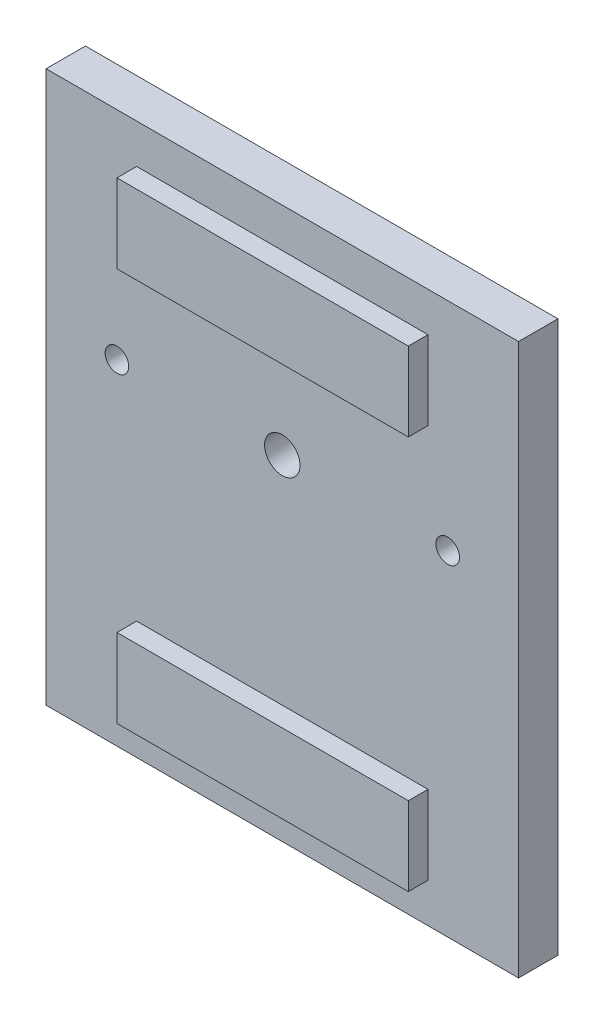
ISO-10303-21;
HEADER;
FILE_DESCRIPTION(('STEP AP214'),'2;1');
FILE_NAME('part.step','',(''),(''),'','','');
FILE_SCHEMA(('AUTOMOTIVE_DESIGN { 1 0 10303 214 1 1 1 1 }'));
ENDSEC;
DATA;
#1=APPLICATION_CONTEXT('core data for automotive mechanical design processes');
#2=APPLICATION_PROTOCOL_DEFINITION('international standard','automotive_design',2000,#1);
#3=PRODUCT_CONTEXT('',#1,'mechanical');
#4=PRODUCT('Part','Part','',(#3));
#5=PRODUCT_RELATED_PRODUCT_CATEGORY('part','',(#4));
#6=PRODUCT_DEFINITION_FORMATION('','',#4);
#7=PRODUCT_DEFINITION_CONTEXT('part definition',#1,'design');
#8=PRODUCT_DEFINITION('design','',#6,#7);
#9=PRODUCT_DEFINITION_SHAPE('','',#8);
#10=(LENGTH_UNIT() NAMED_UNIT(*) SI_UNIT(.MILLI.,.METRE.));
#11=(NAMED_UNIT(*) PLANE_ANGLE_UNIT() SI_UNIT($,.RADIAN.));
#12=(NAMED_UNIT(*) SI_UNIT($,.STERADIAN.) SOLID_ANGLE_UNIT());
#13=UNCERTAINTY_MEASURE_WITH_UNIT(LENGTH_MEASURE(1.E-05),#10,'distance_accuracy_value','');
#14=(GEOMETRIC_REPRESENTATION_CONTEXT(3) GLOBAL_UNCERTAINTY_ASSIGNED_CONTEXT((#13)) GLOBAL_UNIT_ASSIGNED_CONTEXT((#10,
#11,#12)) REPRESENTATION_CONTEXT('',''));
#15=CARTESIAN_POINT('',(0.,0.,0.));
#16=DIRECTION('',(0.,0.,1.));
#17=DIRECTION('',(1.,0.,0.));
#18=AXIS2_PLACEMENT_3D('',#15,#16,#17);
#19=CARTESIAN_POINT('',(0.,0.,10.));
#20=DIRECTION('',(0.,0.,-1.));
#21=DIRECTION('',(-1.,0.,0.));
#22=AXIS2_PLACEMENT_3D('',#19,#20,#21);
#23=PLANE('',#22);
#24=CARTESIAN_POINT('',(-102.,-55.,10.));
#25=DIRECTION('',(0.,0.,-1.));
#26=DIRECTION('',(-1.,0.,0.));
#27=AXIS2_PLACEMENT_3D('',#24,#25,#26);
#28=CIRCLE('',#27,3.00000000000001);
#29=CARTESIAN_POINT('',(-105.,-55.,10.));
#30=VERTEX_POINT('',#29);
#31=EDGE_CURVE('E406',#30,#30,#28,.T.);
#32=ORIENTED_EDGE('',*,*,#31,.T.);
#33=EDGE_LOOP('',(#32));
#34=FACE_BOUND('',#33,.T.);
#35=CARTESIAN_POINT('',(-60.,-55.,10.));
#36=DIRECTION('',(0.,0.,-1.));
#37=DIRECTION('',(-1.,0.,0.));
#38=AXIS2_PLACEMENT_3D('',#35,#36,#37);
#39=CIRCLE('',#38,4.50000000000001);
#40=CARTESIAN_POINT('',(-64.5,-55.,10.));
#41=VERTEX_POINT('',#40);
#42=EDGE_CURVE('E407',#41,#41,#39,.T.);
#43=ORIENTED_EDGE('',*,*,#42,.T.);
#44=EDGE_LOOP('',(#43));
#45=FACE_BOUND('',#44,.T.);
#46=CARTESIAN_POINT('',(-18.,-55.,10.));
#47=DIRECTION('',(0.,0.,-1.));
#48=DIRECTION('',(-1.,0.,0.));
#49=AXIS2_PLACEMENT_3D('',#46,#47,#48);
#50=CIRCLE('',#49,3.);
#51=CARTESIAN_POINT('',(-21.,-55.,10.));
#52=VERTEX_POINT('',#51);
#53=EDGE_CURVE('E411',#52,#52,#50,.T.);
#54=ORIENTED_EDGE('',*,*,#53,.T.);
#55=EDGE_LOOP('',(#54));
#56=FACE_BOUND('',#55,.T.);
#57=DIRECTION('',(0.,-1.,0.));
#58=VECTOR('',#57,1.);
#59=CARTESIAN_POINT('',(-97.,-10.,10.));
#60=LINE('',#59,#58);
#61=CARTESIAN_POINT('',(-97.,-10.,10.));
#62=VERTEX_POINT('',#61);
#63=CARTESIAN_POINT('',(-97.,-30.,10.));
#64=VERTEX_POINT('',#63);
#65=EDGE_CURVE('E145',#62,#64,#60,.T.);
#66=ORIENTED_EDGE('',*,*,#65,.F.);
#67=DIRECTION('',(-1.,0.,0.));
#68=VECTOR('',#67,1.);
#69=CARTESIAN_POINT('',(-97.,-10.,10.));
#70=LINE('',#69,#68);
#71=CARTESIAN_POINT('',(-23.,-10.,10.));
#72=VERTEX_POINT('',#71);
#73=EDGE_CURVE('E158',#72,#62,#70,.T.);
#74=ORIENTED_EDGE('',*,*,#73,.F.);
#75=DIRECTION('',(0.,1.,0.));
#76=VECTOR('',#75,1.);
#77=CARTESIAN_POINT('',(-23.,-10.,10.));
#78=LINE('',#77,#76);
#79=CARTESIAN_POINT('',(-23.,-30.,10.));
#80=VERTEX_POINT('',#79);
#81=EDGE_CURVE('E167',#80,#72,#78,.T.);
#82=ORIENTED_EDGE('',*,*,#81,.F.);
#83=DIRECTION('',(1.,0.,0.));
#84=VECTOR('',#83,1.);
#85=CARTESIAN_POINT('',(-97.,-30.,10.));
#86=LINE('',#85,#84);
#87=EDGE_CURVE('E148',#64,#80,#86,.T.);
#88=ORIENTED_EDGE('',*,*,#87,.F.);
#89=EDGE_LOOP('',(#66,#74,#82,#88));
#90=FACE_BOUND('',#89,.T.);
#91=DIRECTION('',(0.,1.,0.));
#92=VECTOR('',#91,1.);
#93=CARTESIAN_POINT('',(0.,0.,10.));
#94=LINE('',#93,#92);
#95=CARTESIAN_POINT('',(0.,-140.,10.));
#96=VERTEX_POINT('',#95);
#97=CARTESIAN_POINT('',(0.,0.,10.));
#98=VERTEX_POINT('',#97);
#99=EDGE_CURVE('E184',#96,#98,#94,.T.);
#100=ORIENTED_EDGE('',*,*,#99,.T.);
#101=DIRECTION('',(-1.,0.,0.));
#102=VECTOR('',#101,1.);
#103=CARTESIAN_POINT('',(0.,0.,10.));
#104=LINE('',#103,#102);
#105=CARTESIAN_POINT('',(-120.,0.,10.));
#106=VERTEX_POINT('',#105);
#107=EDGE_CURVE('E187',#98,#106,#104,.T.);
#108=ORIENTED_EDGE('',*,*,#107,.T.);
#109=DIRECTION('',(0.,-1.,0.));
#110=VECTOR('',#109,1.);
#111=CARTESIAN_POINT('',(-120.,0.,10.));
#112=LINE('',#111,#110);
#113=CARTESIAN_POINT('',(-120.,-140.,10.));
#114=VERTEX_POINT('',#113);
#115=EDGE_CURVE('E190',#106,#114,#112,.T.);
#116=ORIENTED_EDGE('',*,*,#115,.T.);
#117=DIRECTION('',(1.,0.,0.));
#118=VECTOR('',#117,1.);
#119=CARTESIAN_POINT('',(0.,-140.,10.));
#120=LINE('',#119,#118);
#121=EDGE_CURVE('E192',#114,#96,#120,.T.);
#122=ORIENTED_EDGE('',*,*,#121,.T.);
#123=EDGE_LOOP('',(#100,#108,#116,#122));
#124=FACE_BOUND('',#123,.T.);
#125=DIRECTION('',(0.,-1.,0.));
#126=VECTOR('',#125,1.);
#127=CARTESIAN_POINT('',(-97.,-110.,10.));
#128=LINE('',#127,#126);
#129=CARTESIAN_POINT('',(-97.,-110.,10.));
#130=VERTEX_POINT('',#129);
#131=CARTESIAN_POINT('',(-97.,-130.,10.));
#132=VERTEX_POINT('',#131);
#133=EDGE_CURVE('E144',#130,#132,#128,.T.);
#134=ORIENTED_EDGE('',*,*,#133,.F.);
#135=DIRECTION('',(-1.,0.,0.));
#136=VECTOR('',#135,1.);
#137=CARTESIAN_POINT('',(-97.,-110.,10.));
#138=LINE('',#137,#136);
#139=CARTESIAN_POINT('',(-23.,-110.,10.));
#140=VERTEX_POINT('',#139);
#141=EDGE_CURVE('E141',#140,#130,#138,.T.);
#142=ORIENTED_EDGE('',*,*,#141,.F.);
#143=DIRECTION('',(0.,1.,0.));
#144=VECTOR('',#143,1.);
#145=CARTESIAN_POINT('',(-23.,-110.,10.));
#146=LINE('',#145,#144);
#147=CARTESIAN_POINT('',(-23.,-130.,10.));
#148=VERTEX_POINT('',#147);
#149=EDGE_CURVE('E55',#148,#140,#146,.T.);
#150=ORIENTED_EDGE('',*,*,#149,.F.);
#151=DIRECTION('',(1.,0.,0.));
#152=VECTOR('',#151,1.);
#153=CARTESIAN_POINT('',(-97.,-130.,10.));
#154=LINE('',#153,#152);
#155=EDGE_CURVE('E50',#132,#148,#154,.T.);
#156=ORIENTED_EDGE('',*,*,#155,.F.);
#157=EDGE_LOOP('',(#134,#142,#150,#156));
#158=FACE_BOUND('',#157,.T.);
#159=ADVANCED_FACE('F35',(#34,#45,#56,#90,#124,#158),#23,.F.);
#160=CARTESIAN_POINT('',(0.,0.,10.));
#161=DIRECTION('',(-1.,0.,0.));
#162=DIRECTION('',(0.,-1.,0.));
#163=AXIS2_PLACEMENT_3D('',#160,#161,#162);
#164=PLANE('',#163);
#165=DIRECTION('',(0.,1.,0.));
#166=VECTOR('',#165,1.);
#167=CARTESIAN_POINT('',(0.,0.,0.));
#168=LINE('',#167,#166);
#169=CARTESIAN_POINT('',(0.,-140.,0.));
#170=VERTEX_POINT('',#169);
#171=CARTESIAN_POINT('',(0.,0.,0.));
#172=VERTEX_POINT('',#171);
#173=EDGE_CURVE('E183',#170,#172,#168,.T.);
#174=ORIENTED_EDGE('',*,*,#173,.T.);
#175=DIRECTION('',(0.,0.,-1.));
#176=VECTOR('',#175,1.);
#177=CARTESIAN_POINT('',(0.,0.,10.));
#178=LINE('',#177,#176);
#179=EDGE_CURVE('E11',#98,#172,#178,.T.);
#180=ORIENTED_EDGE('',*,*,#179,.F.);
#181=ORIENTED_EDGE('',*,*,#99,.F.);
#182=DIRECTION('',(0.,0.,-1.));
#183=VECTOR('',#182,1.);
#184=CARTESIAN_POINT('',(0.,-140.,10.));
#185=LINE('',#184,#183);
#186=EDGE_CURVE('E194',#96,#170,#185,.T.);
#187=ORIENTED_EDGE('',*,*,#186,.T.);
#188=EDGE_LOOP('',(#174,#180,#181,#187));
#189=FACE_BOUND('',#188,.T.);
#190=ADVANCED_FACE('F37',(#189),#164,.F.);
#191=CARTESIAN_POINT('',(0.,0.,10.));
#192=DIRECTION('',(0.,-1.,0.));
#193=DIRECTION('',(1.,0.,0.));
#194=AXIS2_PLACEMENT_3D('',#191,#192,#193);
#195=PLANE('',#194);
#196=DIRECTION('',(-1.,0.,0.));
#197=VECTOR('',#196,1.);
#198=CARTESIAN_POINT('',(0.,0.,0.));
#199=LINE('',#198,#197);
#200=CARTESIAN_POINT('',(-120.,0.,0.));
#201=VERTEX_POINT('',#200);
#202=EDGE_CURVE('E197',#172,#201,#199,.T.);
#203=ORIENTED_EDGE('',*,*,#202,.T.);
#204=DIRECTION('',(0.,0.,-1.));
#205=VECTOR('',#204,1.);
#206=CARTESIAN_POINT('',(-120.,0.,10.));
#207=LINE('',#206,#205);
#208=EDGE_CURVE('E43',#106,#201,#207,.T.);
#209=ORIENTED_EDGE('',*,*,#208,.F.);
#210=ORIENTED_EDGE('',*,*,#107,.F.);
#211=ORIENTED_EDGE('',*,*,#179,.T.);
#212=EDGE_LOOP('',(#203,#209,#210,#211));
#213=FACE_BOUND('',#212,.T.);
#214=ADVANCED_FACE('F226',(#213),#195,.F.);
#215=CARTESIAN_POINT('',(-120.,0.,10.));
#216=DIRECTION('',(1.,0.,0.));
#217=DIRECTION('',(0.,1.,0.));
#218=AXIS2_PLACEMENT_3D('',#215,#216,#217);
#219=PLANE('',#218);
#220=DIRECTION('',(0.,-1.,0.));
#221=VECTOR('',#220,1.);
#222=CARTESIAN_POINT('',(-120.,0.,0.));
#223=LINE('',#222,#221);
#224=CARTESIAN_POINT('',(-120.,-140.,0.));
#225=VERTEX_POINT('',#224);
#226=EDGE_CURVE('E199',#201,#225,#223,.T.);
#227=ORIENTED_EDGE('',*,*,#226,.T.);
#228=DIRECTION('',(0.,0.,-1.));
#229=VECTOR('',#228,1.);
#230=CARTESIAN_POINT('',(-120.,-140.,10.));
#231=LINE('',#230,#229);
#232=EDGE_CURVE('E204',#114,#225,#231,.T.);
#233=ORIENTED_EDGE('',*,*,#232,.F.);
#234=ORIENTED_EDGE('',*,*,#115,.F.);
#235=ORIENTED_EDGE('',*,*,#208,.T.);
#236=EDGE_LOOP('',(#227,#233,#234,#235));
#237=FACE_BOUND('',#236,.T.);
#238=ADVANCED_FACE('F211',(#237),#219,.F.);
#239=CARTESIAN_POINT('',(0.,-140.,10.));
#240=DIRECTION('',(0.,1.,0.));
#241=DIRECTION('',(0.,0.,1.));
#242=AXIS2_PLACEMENT_3D('',#239,#240,#241);
#243=PLANE('',#242);
#244=DIRECTION('',(1.,0.,0.));
#245=VECTOR('',#244,1.);
#246=CARTESIAN_POINT('',(0.,-140.,0.));
#247=LINE('',#246,#245);
#248=EDGE_CURVE('E188',#225,#170,#247,.T.);
#249=ORIENTED_EDGE('',*,*,#248,.T.);
#250=ORIENTED_EDGE('',*,*,#186,.F.);
#251=ORIENTED_EDGE('',*,*,#121,.F.);
#252=ORIENTED_EDGE('',*,*,#232,.T.);
#253=EDGE_LOOP('',(#249,#250,#251,#252));
#254=FACE_BOUND('',#253,.T.);
#255=ADVANCED_FACE('F220',(#254),#243,.F.);
#256=CARTESIAN_POINT('',(0.,0.,0.));
#257=DIRECTION('',(0.,0.,-1.));
#258=DIRECTION('',(-1.,0.,0.));
#259=AXIS2_PLACEMENT_3D('',#256,#257,#258);
#260=PLANE('',#259);
#261=CARTESIAN_POINT('',(-102.,-55.,0.));
#262=DIRECTION('',(0.,0.,1.));
#263=DIRECTION('',(1.,0.,0.));
#264=AXIS2_PLACEMENT_3D('',#261,#262,#263);
#265=CIRCLE('',#264,3.00000000000001);
#266=CARTESIAN_POINT('',(-99.,-55.,0.));
#267=VERTEX_POINT('',#266);
#268=EDGE_CURVE('E404',#267,#267,#265,.T.);
#269=ORIENTED_EDGE('',*,*,#268,.T.);
#270=EDGE_LOOP('',(#269));
#271=FACE_BOUND('',#270,.T.);
#272=CARTESIAN_POINT('',(-60.,-55.,0.));
#273=DIRECTION('',(0.,0.,1.));
#274=DIRECTION('',(1.,0.,0.));
#275=AXIS2_PLACEMENT_3D('',#272,#273,#274);
#276=CIRCLE('',#275,4.50000000000001);
#277=CARTESIAN_POINT('',(-55.5,-55.,0.));
#278=VERTEX_POINT('',#277);
#279=EDGE_CURVE('E429',#278,#278,#276,.T.);
#280=ORIENTED_EDGE('',*,*,#279,.T.);
#281=EDGE_LOOP('',(#280));
#282=FACE_BOUND('',#281,.T.);
#283=CARTESIAN_POINT('',(-18.,-55.,0.));
#284=DIRECTION('',(0.,0.,1.));
#285=DIRECTION('',(1.,0.,0.));
#286=AXIS2_PLACEMENT_3D('',#283,#284,#285);
#287=CIRCLE('',#286,3.);
#288=CARTESIAN_POINT('',(-15.,-55.,0.));
#289=VERTEX_POINT('',#288);
#290=EDGE_CURVE('E426',#289,#289,#287,.T.);
#291=ORIENTED_EDGE('',*,*,#290,.T.);
#292=EDGE_LOOP('',(#291));
#293=FACE_BOUND('',#292,.T.);
#294=ORIENTED_EDGE('',*,*,#173,.F.);
#295=ORIENTED_EDGE('',*,*,#248,.F.);
#296=ORIENTED_EDGE('',*,*,#226,.F.);
#297=ORIENTED_EDGE('',*,*,#202,.F.);
#298=EDGE_LOOP('',(#294,#295,#296,#297));
#299=FACE_BOUND('',#298,.T.);
#300=ADVANCED_FACE('F217',(#271,#282,#293,#299),#260,.T.);
#301=CARTESIAN_POINT('',(-97.,-10.,15.));
#302=DIRECTION('',(1.,0.,0.));
#303=DIRECTION('',(0.,0.,-1.));
#304=AXIS2_PLACEMENT_3D('',#301,#302,#303);
#305=PLANE('',#304);
#306=ORIENTED_EDGE('',*,*,#65,.T.);
#307=DIRECTION('',(0.,0.,-1.));
#308=VECTOR('',#307,1.);
#309=CARTESIAN_POINT('',(-97.,-30.,15.));
#310=LINE('',#309,#308);
#311=CARTESIAN_POINT('',(-97.,-30.,15.));
#312=VERTEX_POINT('',#311);
#313=EDGE_CURVE('E180',#312,#64,#310,.T.);
#314=ORIENTED_EDGE('',*,*,#313,.F.);
#315=DIRECTION('',(0.,-1.,0.));
#316=VECTOR('',#315,1.);
#317=CARTESIAN_POINT('',(-97.,-10.,15.));
#318=LINE('',#317,#316);
#319=CARTESIAN_POINT('',(-97.,-10.,15.));
#320=VERTEX_POINT('',#319);
#321=EDGE_CURVE('E154',#320,#312,#318,.T.);
#322=ORIENTED_EDGE('',*,*,#321,.F.);
#323=DIRECTION('',(0.,0.,-1.));
#324=VECTOR('',#323,1.);
#325=CARTESIAN_POINT('',(-97.,-10.,15.));
#326=LINE('',#325,#324);
#327=EDGE_CURVE('E163',#320,#62,#326,.T.);
#328=ORIENTED_EDGE('',*,*,#327,.T.);
#329=EDGE_LOOP('',(#306,#314,#322,#328));
#330=FACE_BOUND('',#329,.T.);
#331=ADVANCED_FACE('F242',(#330),#305,.F.);
#332=CARTESIAN_POINT('',(-97.,-30.,15.));
#333=DIRECTION('',(0.,1.,0.));
#334=DIRECTION('',(0.,0.,1.));
#335=AXIS2_PLACEMENT_3D('',#332,#333,#334);
#336=PLANE('',#335);
#337=ORIENTED_EDGE('',*,*,#87,.T.);
#338=DIRECTION('',(0.,0.,-1.));
#339=VECTOR('',#338,1.);
#340=CARTESIAN_POINT('',(-23.,-30.,15.));
#341=LINE('',#340,#339);
#342=CARTESIAN_POINT('',(-23.,-30.,15.));
#343=VERTEX_POINT('',#342);
#344=EDGE_CURVE('E177',#343,#80,#341,.T.);
#345=ORIENTED_EDGE('',*,*,#344,.F.);
#346=DIRECTION('',(1.,0.,0.));
#347=VECTOR('',#346,1.);
#348=CARTESIAN_POINT('',(-97.,-30.,15.));
#349=LINE('',#348,#347);
#350=EDGE_CURVE('E157',#312,#343,#349,.T.);
#351=ORIENTED_EDGE('',*,*,#350,.F.);
#352=ORIENTED_EDGE('',*,*,#313,.T.);
#353=EDGE_LOOP('',(#337,#345,#351,#352));
#354=FACE_BOUND('',#353,.T.);
#355=ADVANCED_FACE('F263',(#354),#336,.F.);
#356=CARTESIAN_POINT('',(-23.,-10.,15.));
#357=DIRECTION('',(-1.,0.,0.));
#358=DIRECTION('',(0.,0.,1.));
#359=AXIS2_PLACEMENT_3D('',#356,#357,#358);
#360=PLANE('',#359);
#361=ORIENTED_EDGE('',*,*,#81,.T.);
#362=DIRECTION('',(0.,0.,-1.));
#363=VECTOR('',#362,1.);
#364=CARTESIAN_POINT('',(-23.,-10.,15.));
#365=LINE('',#364,#363);
#366=CARTESIAN_POINT('',(-23.,-10.,15.));
#367=VERTEX_POINT('',#366);
#368=EDGE_CURVE('E174',#367,#72,#365,.T.);
#369=ORIENTED_EDGE('',*,*,#368,.F.);
#370=DIRECTION('',(0.,1.,0.));
#371=VECTOR('',#370,1.);
#372=CARTESIAN_POINT('',(-23.,-10.,15.));
#373=LINE('',#372,#371);
#374=EDGE_CURVE('E160',#343,#367,#373,.T.);
#375=ORIENTED_EDGE('',*,*,#374,.F.);
#376=ORIENTED_EDGE('',*,*,#344,.T.);
#377=EDGE_LOOP('',(#361,#369,#375,#376));
#378=FACE_BOUND('',#377,.T.);
#379=ADVANCED_FACE('F270',(#378),#360,.F.);
#380=CARTESIAN_POINT('',(-97.,-10.,15.));
#381=DIRECTION('',(0.,-1.,0.));
#382=DIRECTION('',(0.,0.,-1.));
#383=AXIS2_PLACEMENT_3D('',#380,#381,#382);
#384=PLANE('',#383);
#385=ORIENTED_EDGE('',*,*,#73,.T.);
#386=ORIENTED_EDGE('',*,*,#327,.F.);
#387=DIRECTION('',(-1.,0.,0.));
#388=VECTOR('',#387,1.);
#389=CARTESIAN_POINT('',(-97.,-10.,15.));
#390=LINE('',#389,#388);
#391=EDGE_CURVE('E162',#367,#320,#390,.T.);
#392=ORIENTED_EDGE('',*,*,#391,.F.);
#393=ORIENTED_EDGE('',*,*,#368,.T.);
#394=EDGE_LOOP('',(#385,#386,#392,#393));
#395=FACE_BOUND('',#394,.T.);
#396=ADVANCED_FACE('F277',(#395),#384,.F.);
#397=CARTESIAN_POINT('',(0.,0.,15.));
#398=DIRECTION('',(0.,0.,1.));
#399=DIRECTION('',(1.,0.,0.));
#400=AXIS2_PLACEMENT_3D('',#397,#398,#399);
#401=PLANE('',#400);
#402=ORIENTED_EDGE('',*,*,#321,.T.);
#403=ORIENTED_EDGE('',*,*,#350,.T.);
#404=ORIENTED_EDGE('',*,*,#374,.T.);
#405=ORIENTED_EDGE('',*,*,#391,.T.);
#406=EDGE_LOOP('',(#402,#403,#404,#405));
#407=FACE_BOUND('',#406,.T.);
#408=ADVANCED_FACE('F285',(#407),#401,.T.);
#409=CARTESIAN_POINT('',(-97.,-110.,15.));
#410=DIRECTION('',(1.,0.,0.));
#411=DIRECTION('',(0.,0.,-1.));
#412=AXIS2_PLACEMENT_3D('',#409,#410,#411);
#413=PLANE('',#412);
#414=ORIENTED_EDGE('',*,*,#133,.T.);
#415=DIRECTION('',(0.,0.,-1.));
#416=VECTOR('',#415,1.);
#417=CARTESIAN_POINT('',(-97.,-130.,15.));
#418=LINE('',#417,#416);
#419=CARTESIAN_POINT('',(-97.,-130.,15.));
#420=VERTEX_POINT('',#419);
#421=EDGE_CURVE('E125',#420,#132,#418,.T.);
#422=ORIENTED_EDGE('',*,*,#421,.F.);
#423=DIRECTION('',(0.,-1.,0.));
#424=VECTOR('',#423,1.);
#425=CARTESIAN_POINT('',(-97.,-110.,15.));
#426=LINE('',#425,#424);
#427=CARTESIAN_POINT('',(-97.,-110.,15.));
#428=VERTEX_POINT('',#427);
#429=EDGE_CURVE('E132',#428,#420,#426,.T.);
#430=ORIENTED_EDGE('',*,*,#429,.F.);
#431=DIRECTION('',(0.,0.,-1.));
#432=VECTOR('',#431,1.);
#433=CARTESIAN_POINT('',(-97.,-110.,15.));
#434=LINE('',#433,#432);
#435=EDGE_CURVE('E416',#428,#130,#434,.T.);
#436=ORIENTED_EDGE('',*,*,#435,.T.);
#437=EDGE_LOOP('',(#414,#422,#430,#436));
#438=FACE_BOUND('',#437,.T.);
#439=ADVANCED_FACE('F143',(#438),#413,.F.);
#440=CARTESIAN_POINT('',(-97.,-130.,15.));
#441=DIRECTION('',(0.,1.,0.));
#442=DIRECTION('',(0.,0.,1.));
#443=AXIS2_PLACEMENT_3D('',#440,#441,#442);
#444=PLANE('',#443);
#445=ORIENTED_EDGE('',*,*,#155,.T.);
#446=DIRECTION('',(0.,0.,-1.));
#447=VECTOR('',#446,1.);
#448=CARTESIAN_POINT('',(-23.,-130.,15.));
#449=LINE('',#448,#447);
#450=CARTESIAN_POINT('',(-23.,-130.,15.));
#451=VERTEX_POINT('',#450);
#452=EDGE_CURVE('E128',#451,#148,#449,.T.);
#453=ORIENTED_EDGE('',*,*,#452,.F.);
#454=DIRECTION('',(1.,0.,0.));
#455=VECTOR('',#454,1.);
#456=CARTESIAN_POINT('',(-97.,-130.,15.));
#457=LINE('',#456,#455);
#458=EDGE_CURVE('E121',#420,#451,#457,.T.);
#459=ORIENTED_EDGE('',*,*,#458,.F.);
#460=ORIENTED_EDGE('',*,*,#421,.T.);
#461=EDGE_LOOP('',(#445,#453,#459,#460));
#462=FACE_BOUND('',#461,.T.);
#463=ADVANCED_FACE('F123',(#462),#444,.F.);
#464=CARTESIAN_POINT('',(-23.,-110.,15.));
#465=DIRECTION('',(-1.,0.,0.));
#466=DIRECTION('',(0.,0.,1.));
#467=AXIS2_PLACEMENT_3D('',#464,#465,#466);
#468=PLANE('',#467);
#469=ORIENTED_EDGE('',*,*,#149,.T.);
#470=DIRECTION('',(0.,0.,-1.));
#471=VECTOR('',#470,1.);
#472=CARTESIAN_POINT('',(-23.,-110.,15.));
#473=LINE('',#472,#471);
#474=CARTESIAN_POINT('',(-23.,-110.,15.));
#475=VERTEX_POINT('',#474);
#476=EDGE_CURVE('E150',#475,#140,#473,.T.);
#477=ORIENTED_EDGE('',*,*,#476,.F.);
#478=DIRECTION('',(0.,1.,0.));
#479=VECTOR('',#478,1.);
#480=CARTESIAN_POINT('',(-23.,-110.,15.));
#481=LINE('',#480,#479);
#482=EDGE_CURVE('E131',#451,#475,#481,.T.);
#483=ORIENTED_EDGE('',*,*,#482,.F.);
#484=ORIENTED_EDGE('',*,*,#452,.T.);
#485=EDGE_LOOP('',(#469,#477,#483,#484));
#486=FACE_BOUND('',#485,.T.);
#487=ADVANCED_FACE('F306',(#486),#468,.F.);
#488=CARTESIAN_POINT('',(-97.,-110.,15.));
#489=DIRECTION('',(0.,-1.,0.));
#490=DIRECTION('',(0.,0.,-1.));
#491=AXIS2_PLACEMENT_3D('',#488,#489,#490);
#492=PLANE('',#491);
#493=ORIENTED_EDGE('',*,*,#141,.T.);
#494=ORIENTED_EDGE('',*,*,#435,.F.);
#495=DIRECTION('',(-1.,0.,0.));
#496=VECTOR('',#495,1.);
#497=CARTESIAN_POINT('',(-97.,-110.,15.));
#498=LINE('',#497,#496);
#499=EDGE_CURVE('E137',#475,#428,#498,.T.);
#500=ORIENTED_EDGE('',*,*,#499,.F.);
#501=ORIENTED_EDGE('',*,*,#476,.T.);
#502=EDGE_LOOP('',(#493,#494,#500,#501));
#503=FACE_BOUND('',#502,.T.);
#504=ADVANCED_FACE('F313',(#503),#492,.F.);
#505=CARTESIAN_POINT('',(0.,0.,15.));
#506=DIRECTION('',(0.,0.,1.));
#507=DIRECTION('',(1.,0.,0.));
#508=AXIS2_PLACEMENT_3D('',#505,#506,#507);
#509=PLANE('',#508);
#510=ORIENTED_EDGE('',*,*,#429,.T.);
#511=ORIENTED_EDGE('',*,*,#458,.T.);
#512=ORIENTED_EDGE('',*,*,#482,.T.);
#513=ORIENTED_EDGE('',*,*,#499,.T.);
#514=EDGE_LOOP('',(#510,#511,#512,#513));
#515=FACE_BOUND('',#514,.T.);
#516=ADVANCED_FACE('F135',(#515),#509,.T.);
#517=CARTESIAN_POINT('',(-18.,-55.,0.));
#518=DIRECTION('',(0.,0.,1.));
#519=DIRECTION('',(1.,0.,0.));
#520=AXIS2_PLACEMENT_3D('',#517,#518,#519);
#521=CYLINDRICAL_SURFACE('',#520,3.);
#522=ORIENTED_EDGE('',*,*,#290,.F.);
#523=EDGE_LOOP('',(#522));
#524=FACE_BOUND('',#523,.T.);
#525=ORIENTED_EDGE('',*,*,#53,.F.);
#526=EDGE_LOOP('',(#525));
#527=FACE_BOUND('',#526,.T.);
#528=ADVANCED_FACE('F328',(#524,#527),#521,.F.);
#529=CARTESIAN_POINT('',(-60.,-55.,0.));
#530=DIRECTION('',(0.,0.,1.));
#531=DIRECTION('',(1.,0.,0.));
#532=AXIS2_PLACEMENT_3D('',#529,#530,#531);
#533=CYLINDRICAL_SURFACE('',#532,4.50000000000001);
#534=ORIENTED_EDGE('',*,*,#279,.F.);
#535=EDGE_LOOP('',(#534));
#536=FACE_BOUND('',#535,.T.);
#537=ORIENTED_EDGE('',*,*,#42,.F.);
#538=EDGE_LOOP('',(#537));
#539=FACE_BOUND('',#538,.T.);
#540=ADVANCED_FACE('F334',(#536,#539),#533,.F.);
#541=CARTESIAN_POINT('',(-102.,-55.,0.));
#542=DIRECTION('',(0.,0.,1.));
#543=DIRECTION('',(1.,0.,0.));
#544=AXIS2_PLACEMENT_3D('',#541,#542,#543);
#545=CYLINDRICAL_SURFACE('',#544,3.00000000000001);
#546=ORIENTED_EDGE('',*,*,#268,.F.);
#547=EDGE_LOOP('',(#546));
#548=FACE_BOUND('',#547,.T.);
#549=ORIENTED_EDGE('',*,*,#31,.F.);
#550=EDGE_LOOP('',(#549));
#551=FACE_BOUND('',#550,.T.);
#552=ADVANCED_FACE('F342',(#548,#551),#545,.F.);
#553=CLOSED_SHELL('',(#159,#190,#214,#238,#255,#300,#331,#355,#379,#396,#408,#439,#463,#487,
#504,#516,#528,#540,#552));
#554=MANIFOLD_SOLID_BREP('B2',#553);
#555=ADVANCED_BREP_SHAPE_REPRESENTATION('',(#18,#554),#14);
#556=SHAPE_DEFINITION_REPRESENTATION(#9,#555);
ENDSEC;
END-ISO-10303-21;
